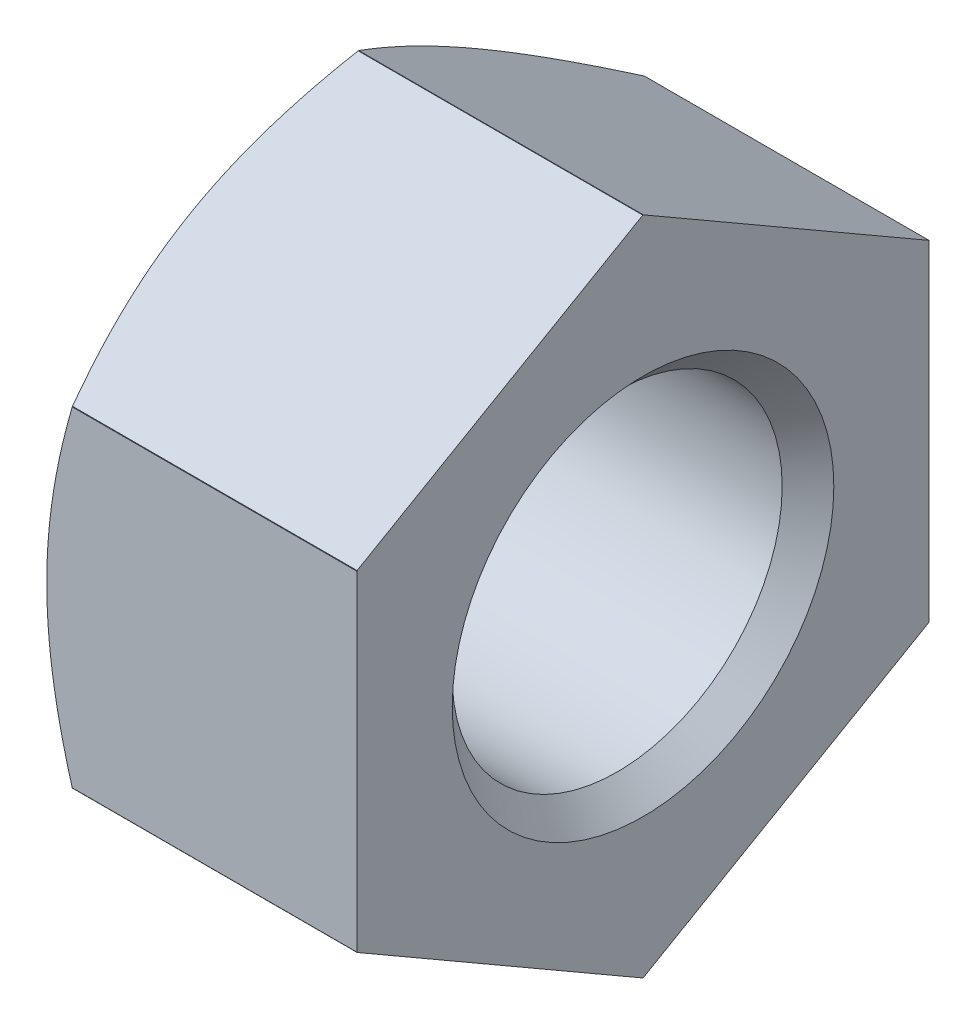
ISO-10303-21;
HEADER;
FILE_DESCRIPTION(('STEP AP214'),'2;1');
FILE_NAME('part.step','',(''),(''),'','','');
FILE_SCHEMA(('AUTOMOTIVE_DESIGN { 1 0 10303 214 1 1 1 1 }'));
ENDSEC;
DATA;
#1=APPLICATION_CONTEXT('core data for automotive mechanical design processes');
#2=APPLICATION_PROTOCOL_DEFINITION('international standard','automotive_design',2000,#1);
#3=PRODUCT_CONTEXT('',#1,'mechanical');
#4=PRODUCT('Part','Part','',(#3));
#5=PRODUCT_RELATED_PRODUCT_CATEGORY('part','',(#4));
#6=PRODUCT_DEFINITION_FORMATION('','',#4);
#7=PRODUCT_DEFINITION_CONTEXT('part definition',#1,'design');
#8=PRODUCT_DEFINITION('design','',#6,#7);
#9=PRODUCT_DEFINITION_SHAPE('','',#8);
#10=(LENGTH_UNIT() NAMED_UNIT(*) SI_UNIT(.MILLI.,.METRE.));
#11=(NAMED_UNIT(*) PLANE_ANGLE_UNIT() SI_UNIT($,.RADIAN.));
#12=(NAMED_UNIT(*) SI_UNIT($,.STERADIAN.) SOLID_ANGLE_UNIT());
#13=UNCERTAINTY_MEASURE_WITH_UNIT(LENGTH_MEASURE(1.E-05),#10,'distance_accuracy_value','');
#14=(GEOMETRIC_REPRESENTATION_CONTEXT(3) GLOBAL_UNCERTAINTY_ASSIGNED_CONTEXT((#13)) GLOBAL_UNIT_ASSIGNED_CONTEXT((#10,
#11,#12)) REPRESENTATION_CONTEXT('',''));
#15=CARTESIAN_POINT('',(0.,0.,0.));
#16=DIRECTION('',(0.,0.,1.));
#17=DIRECTION('',(1.,0.,0.));
#18=AXIS2_PLACEMENT_3D('',#15,#16,#17);
#19=CARTESIAN_POINT('',(-6.5,0.,0.));
#20=DIRECTION('',(1.,0.,0.));
#21=DIRECTION('',(0.,0.,-1.));
#22=AXIS2_PLACEMENT_3D('',#19,#20,#21);
#23=CONICAL_SURFACE('',#22,12.,1.0471975511966);
#24=CARTESIAN_POINT('',(-5.43190200199919,0.,0.));
#25=DIRECTION('',(1.,0.,0.));
#26=DIRECTION('',(0.,0.,-1.));
#27=AXIS2_PLACEMENT_3D('',#24,#25,#26);
#28=CIRCLE('',#27,13.85);
#29=CARTESIAN_POINT('',(-5.43190200199919,-6.91538140669045,12.));
#30=VERTEX_POINT('',#29);
#31=CARTESIAN_POINT('',(-5.43190200199919,-6.93461414206804,11.9888959750525));
#32=VERTEX_POINT('',#31);
#33=EDGE_CURVE('E319',#30,#32,#28,.T.);
#34=ORIENTED_EDGE('',*,*,#33,.F.);
#35=CARTESIAN_POINT('',(-0.757927526922083,-18.3741029494494,12.));
#36=CARTESIAN_POINT('',(-0.885260822662816,-18.1106808035902,12.));
#37=CARTESIAN_POINT('',(-1.01193507119495,-17.8469402441711,12.));
#38=CARTESIAN_POINT('',(-1.26381419692446,-17.3187550288704,12.));
#39=CARTESIAN_POINT('',(-1.38901905797828,-17.0543103652923,12.));
#40=CARTESIAN_POINT('',(-1.7622389296602,-16.2597418499713,12.));
#41=CARTESIAN_POINT('',(-2.00781770862917,-15.7284691213862,12.));
#42=CARTESIAN_POINT('',(-2.49229843461505,-14.6592118406064,12.));
#43=CARTESIAN_POINT('',(-2.7311541257373,-14.1212062772096,12.));
#44=CARTESIAN_POINT('',(-3.19860942107949,-13.0407736014293,12.));
#45=CARTESIAN_POINT('',(-3.42720955994547,-12.4983467212856,12.));
#46=CARTESIAN_POINT('',(-3.87413298289837,-11.4014775288701,12.));
#47=CARTESIAN_POINT('',(-4.09229571424787,-10.8469694543956,12.));
#48=CARTESIAN_POINT('',(-4.5115342101104,-9.73140877724123,12.));
#49=CARTESIAN_POINT('',(-4.71260807351314,-9.17035545428785,12.));
#50=CARTESIAN_POINT('',(-5.09226294047572,-8.04198268106347,12.));
#51=CARTESIAN_POINT('',(-5.27089176830113,-7.47467945477915,12.));
#52=CARTESIAN_POINT('',(-5.5998637219091,-6.33195340918127,12.));
#53=CARTESIAN_POINT('',(-5.75021579315801,-5.75653321983807,12.));
#54=CARTESIAN_POINT('',(-5.94903218423929,-4.8872057450023,12.));
#55=CARTESIAN_POINT('',(-6.01086255084975,-4.59633525052163,12.));
#56=CARTESIAN_POINT('',(-6.12464301765479,-4.0126582574801,12.));
#57=CARTESIAN_POINT('',(-6.1765933329094,-3.71985180120309,12.));
#58=CARTESIAN_POINT('',(-6.26969355142856,-3.13249368902774,12.));
#59=CARTESIAN_POINT('',(-6.31084257234311,-2.83794189256234,12.));
#60=CARTESIAN_POINT('',(-6.3815108239869,-2.247448713856,12.));
#61=CARTESIAN_POINT('',(-6.41103051995103,-1.95150738768304,12.));
#62=CARTESIAN_POINT('',(-6.45764834044768,-1.36052731467124,12.));
#63=CARTESIAN_POINT('',(-6.47482393929811,-1.06549471929991,12.));
#64=CARTESIAN_POINT('',(-6.4966623552002,-0.474967566223815,12.));
#65=CARTESIAN_POINT('',(-6.50132533469031,-0.179473014565973,12.));
#66=CARTESIAN_POINT('',(-6.49802788750281,0.411363860950024,12.));
#67=CARTESIAN_POINT('',(-6.49007100291559,0.706706204256779,12.));
#68=CARTESIAN_POINT('',(-6.46173155162532,1.29679806430548,12.));
#69=CARTESIAN_POINT('',(-6.44134836459105,1.59154755071448,12.));
#70=CARTESIAN_POINT('',(-6.37731043762117,2.30594606358188,12.));
#71=CARTESIAN_POINT('',(-6.32742876921308,2.72504606016678,12.));
#72=CARTESIAN_POINT('',(-6.20531157582008,3.56003413695209,12.));
#73=CARTESIAN_POINT('',(-6.13306995085723,3.97592130889583,12.));
#74=CARTESIAN_POINT('',(-5.96879494132217,4.80414082533594,12.));
#75=CARTESIAN_POINT('',(-5.87674284161843,5.21646942223613,12.));
#76=CARTESIAN_POINT('',(-5.67565579750479,6.03688413058347,12.));
#77=CARTESIAN_POINT('',(-5.56662245268445,6.44497063776614,12.));
#78=CARTESIAN_POINT('',(-5.33133023705024,7.26695179192741,12.));
#79=CARTESIAN_POINT('',(-5.20471466714229,7.68074363990891,12.));
#80=CARTESIAN_POINT('',(-4.93897810435373,8.5039527317277,12.));
#81=CARTESIAN_POINT('',(-4.79986573739325,8.91337277809569,12.));
#82=CARTESIAN_POINT('',(-4.51199132897044,9.72619919952538,12.));
#83=CARTESIAN_POINT('',(-4.36328801163378,10.1296264525863,12.));
#84=CARTESIAN_POINT('',(-4.13374059216835,10.7323754675621,12.));
#85=CARTESIAN_POINT('',(-4.05612530245974,10.9329360828662,12.));
#86=CARTESIAN_POINT('',(-3.89892093988125,11.333277207607,12.));
#87=CARTESIAN_POINT('',(-3.81933191298797,11.5330577350899,12.));
#88=CARTESIAN_POINT('',(-3.73884482138752,11.7324762572811,12.));
#89=B_SPLINE_CURVE_WITH_KNOTS('',3,(#35,#36,#37,#38,#39,#40,#41,#42,#43,#44,#45,#46,#47,#48,#49,
#50,#51,#52,#53,#54,#55,#56,#57,#58,#59,#60,#61,#62,#63,#64,#65,#66,#67,#68,#69,#70,#71,#72,#73,
#74,#75,#76,#77,#78,#79,#80,#81,#82,#83,#84,#85,#86,#87,#88),.UNSPECIFIED.,.F.,.F.,(4,2,2,2,2,2,
2,2,2,2,2,2,2,2,2,2,2,2,2,2,2,2,2,2,2,2,4),(0.,0.877748230184936,1.75550609481917,
3.51130735039889,5.27715724351261,7.04291497149047,8.83034291642293,10.6179694503848,
12.4017200100453,14.184905320284,15.0768731076703,15.9688214772858,16.8608426868666,
17.7528282072264,18.6391653423303,19.525490970976,20.41156787349,21.2976890133128,
22.5631579147536,23.8289723511392,25.0959879045465,26.362884180457,27.660832313829,
28.9578913226118,30.2476493893806,30.89280627481,31.5379481459269),.UNSPECIFIED.);
#90=CARTESIAN_POINT('',(-6.5,0.,12.));
#91=VERTEX_POINT('',#90);
#92=EDGE_CURVE('E160',#30,#91,#89,.T.);
#93=ORIENTED_EDGE('',*,*,#92,.T.);
#94=CARTESIAN_POINT('',(-6.5,0.,0.));
#95=DIRECTION('',(1.,0.,0.));
#96=DIRECTION('',(0.,0.,-1.));
#97=AXIS2_PLACEMENT_3D('',#94,#95,#96);
#98=CIRCLE('',#97,12.);
#99=CARTESIAN_POINT('',(-6.5,-10.3923048454133,6.));
#100=VERTEX_POINT('',#99);
#101=EDGE_CURVE('E153',#91,#100,#98,.T.);
#102=ORIENTED_EDGE('',*,*,#101,.T.);
#103=CARTESIAN_POINT('',(-5.43178412335734,-13.8502,0.0107499050095311));
#104=CARTESIAN_POINT('',(-5.51954638529781,-13.6979738038674,0.274413410954166));
#105=CARTESIAN_POINT('',(-5.60331559726915,-13.5451538807077,0.539105282275555));
#106=CARTESIAN_POINT('',(-5.76175983099681,-13.2382892700276,1.07061037901832));
#107=CARTESIAN_POINT('',(-5.83643186228856,-13.0842441974027,1.33742427146024));
#108=CARTESIAN_POINT('',(-5.9756755793296,-12.7746338925914,1.87368504994032));
#109=CARTESIAN_POINT('',(-6.0402234856649,-12.6190659670349,2.14313660103218));
#110=CARTESIAN_POINT('',(-6.15783260004203,-12.3068511000128,2.68390861359285));
#111=CARTESIAN_POINT('',(-6.21089446519067,-12.1502042208025,2.95522896723224));
#112=CARTESIAN_POINT('',(-6.30327643468492,-11.8398391225771,3.49279708625475));
#113=CARTESIAN_POINT('',(-6.3429029056729,-11.6861438399104,3.7590051247172));
#114=CARTESIAN_POINT('',(-6.40929551949309,-11.3780520477653,4.29263576210746));
#115=CARTESIAN_POINT('',(-6.43606141293658,-11.2236555247472,4.56005838448664));
#116=CARTESIAN_POINT('',(-6.47605719279432,-10.9146058526798,5.09534811856997));
#117=CARTESIAN_POINT('',(-6.4893031052307,-10.7599532256232,5.36321432615598));
#118=CARTESIAN_POINT('',(-6.50197442821406,-10.4505086981026,5.89918796994576));
#119=CARTESIAN_POINT('',(-6.50140027079916,-10.2957168021437,6.16729539834655));
#120=CARTESIAN_POINT('',(-6.4874393555501,-10.0067403447611,6.66781730472444));
#121=CARTESIAN_POINT('',(-6.47575492760503,-9.87253437048549,6.9002688708491));
#122=CARTESIAN_POINT('',(-6.44221872865832,-9.60443172221048,7.36463627930519));
#123=CARTESIAN_POINT('',(-6.42036624578965,-9.47053507052651,7.59655208298518));
#124=CARTESIAN_POINT('',(-6.36687229345426,-9.2031235281042,8.05972246099098));
#125=CARTESIAN_POINT('',(-6.33522282499089,-9.06960903962346,8.2909763385862));
#126=CARTESIAN_POINT('',(-6.26268633334446,-8.80320412855406,8.75240317994426));
#127=CARTESIAN_POINT('',(-6.22179868699997,-8.67031374868223,8.9825760697194));
#128=CARTESIAN_POINT('',(-6.08424821977632,-8.2669409610675,9.68123823225881));
#129=CARTESIAN_POINT('',(-5.97391418845705,-7.99762212777088,10.1477121349637));
#130=CARTESIAN_POINT('',(-5.72355518880478,-7.46298250917926,11.0737351181037));
#131=CARTESIAN_POINT('',(-5.58358838305639,-7.19765496688166,11.5332959020105));
#132=CARTESIAN_POINT('',(-5.4317020019992,-6.93426726314663,11.9894967869685));
#133=B_SPLINE_CURVE_WITH_KNOTS('',3,(#103,#104,#105,#106,#107,#108,#109,#110,#111,#112,#113,
#114,#115,#116,#117,#118,#119,#120,#121,#122,#123,#124,#125,#126,#127,#128,#129,#130,#131,#132),
.UNSPECIFIED.,.F.,.F.,(4,2,2,2,2,2,2,2,2,2,2,2,2,2,4),(0.,0.950572713737903,1.90145706550251,
2.85454243507171,3.80757326500351,4.73712269275389,5.66669014534033,6.5951544432594,
7.5235897158951,8.32939544034746,9.13525758786965,9.94177944518852,10.7483557227025,
12.3968110169832,14.0420602673549),.UNSPECIFIED.);
#134=EDGE_CURVE('E126',#100,#32,#133,.T.);
#135=ORIENTED_EDGE('',*,*,#134,.T.);
#136=EDGE_LOOP('',(#34,#93,#102,#135));
#137=FACE_BOUND('',#136,.T.);
#138=ADVANCED_FACE('F16',(#137),#23,.T.);
#139=CARTESIAN_POINT('',(-6.5,10.3923048454133,6.));
#140=VERTEX_POINT('',#139);
#141=EDGE_CURVE('E161',#140,#91,#98,.T.);
#142=ORIENTED_EDGE('',*,*,#141,.T.);
#143=CARTESIAN_POINT('',(-5.43190200199919,6.91538140669045,12.));
#144=VERTEX_POINT('',#143);
#145=EDGE_CURVE('E225',#91,#144,#89,.T.);
#146=ORIENTED_EDGE('',*,*,#145,.T.);
#147=CARTESIAN_POINT('',(-5.43190200199919,6.93461414206805,11.9888959750525));
#148=VERTEX_POINT('',#147);
#149=EDGE_CURVE('E339',#148,#144,#28,.T.);
#150=ORIENTED_EDGE('',*,*,#149,.F.);
#151=CARTESIAN_POINT('',(-5.43170200199919,6.93426726314663,11.9894967869685));
#152=CARTESIAN_POINT('',(-5.5194676389763,7.08649461080452,11.7258312865235));
#153=CARTESIAN_POINT('',(-5.60324031293054,7.23931569065741,11.4611374117508));
#154=CARTESIAN_POINT('',(-5.76169162740055,7.54618263899107,10.9296282660733));
#155=CARTESIAN_POINT('',(-5.83636727748469,7.70022889258637,10.6628123281306));
#156=CARTESIAN_POINT('',(-5.97561839288176,8.00984163269987,10.1265473315834));
#157=CARTESIAN_POINT('',(-6.04017007685509,8.16541081292757,9.85709360733716));
#158=CARTESIAN_POINT('',(-6.15778683720267,8.47762824215075,9.31631715691408));
#159=CARTESIAN_POINT('',(-6.21085257069147,8.6342764288866,9.04499453857403));
#160=CARTESIAN_POINT('',(-6.30324219234936,8.94464412161213,8.5074219257455));
#161=CARTESIAN_POINT('',(-6.34287245083263,9.09834068927069,8.24121166161192));
#162=CARTESIAN_POINT('',(-6.40927259713642,9.4064351269859,7.70757644195981));
#163=CARTESIAN_POINT('',(-6.43604223556411,9.56083301058385,7.44015146298706));
#164=CARTESIAN_POINT('',(-6.47604536531801,9.8698854733242,6.90485689531648));
#165=CARTESIAN_POINT('',(-6.48929488371125,10.0245395303485,6.63698821095383));
#166=CARTESIAN_POINT('',(-6.50197319012622,10.3339869968297,6.10100947673489));
#167=CARTESIAN_POINT('',(-6.50140241026684,10.4887804017783,5.83289943468725));
#168=CARTESIAN_POINT('',(-6.48744764612505,10.7777569185845,5.33237742538465));
#169=CARTESIAN_POINT('',(-6.47576624921605,10.9119614375112,5.09992837999829));
#170=CARTESIAN_POINT('',(-6.44223625182418,11.1800612346947,4.63556590977753));
#171=CARTESIAN_POINT('',(-6.42038693952648,11.3139564906417,4.40365252358494));
#172=CARTESIAN_POINT('',(-6.36689940946633,11.581365295729,3.94048688678237));
#173=CARTESIAN_POINT('',(-6.33525319296208,11.7148784426688,3.70923533280428));
#174=CARTESIAN_POINT('',(-6.26272323054005,11.9812807226483,3.24781304862764));
#175=CARTESIAN_POINT('',(-6.22183886147274,12.1141698129754,3.01764239240948));
#176=CARTESIAN_POINT('',(-6.08429835406982,12.5175386743094,2.3189870303878));
#177=CARTESIAN_POINT('',(-5.97397097377286,12.7868549423786,1.85251757078705));
#178=CARTESIAN_POINT('',(-5.72362494311967,13.3214895761709,0.926503221572832));
#179=CARTESIAN_POINT('',(-5.58366445276763,13.5868146983092,0.466946629504849));
#180=CARTESIAN_POINT('',(-5.43178412335734,13.8502,0.010749905009532));
#181=B_SPLINE_CURVE_WITH_KNOTS('',3,(#151,#152,#153,#154,#155,#156,#157,#158,#159,#160,#161,
#162,#163,#164,#165,#166,#167,#168,#169,#170,#171,#172,#173,#174,#175,#176,#177,#178,#179,#180),
.UNSPECIFIED.,.F.,.F.,(4,2,2,2,2,2,2,2,2,2,2,2,2,2,4),(0.,0.950582158069122,1.90147595913919,
2.85457100728535,3.80761151416831,4.73717004316529,5.66674659741063,6.59521992519702,
7.52366422247089,8.32946083280679,9.13531386220705,9.94182657819448,10.7483937128688,
12.3968299015406,14.0420602587557),.UNSPECIFIED.);
#182=EDGE_CURVE('E257',#148,#140,#181,.T.);
#183=ORIENTED_EDGE('',*,*,#182,.T.);
#184=EDGE_LOOP('',(#142,#146,#150,#183));
#185=FACE_BOUND('',#184,.T.);
#186=ADVANCED_FACE('F370',(#185),#23,.T.);
#187=CARTESIAN_POINT('',(-6.5,0.,-12.));
#188=VERTEX_POINT('',#187);
#189=CARTESIAN_POINT('',(-6.5,10.3923048454133,-6.));
#190=VERTEX_POINT('',#189);
#191=EDGE_CURVE('E167',#188,#190,#98,.T.);
#192=ORIENTED_EDGE('',*,*,#191,.T.);
#193=CARTESIAN_POINT('',(-5.43178412335734,13.8502,-0.0107499050095311));
#194=CARTESIAN_POINT('',(-5.51954638529781,13.6979738038674,-0.274413410954166));
#195=CARTESIAN_POINT('',(-5.60331559726915,13.5451538807077,-0.539105282275555));
#196=CARTESIAN_POINT('',(-5.76175983099681,13.2382892700276,-1.07061037901832));
#197=CARTESIAN_POINT('',(-5.83643186228856,13.0842441974027,-1.33742427146024));
#198=CARTESIAN_POINT('',(-5.9756755793296,12.7746338925914,-1.87368504994032));
#199=CARTESIAN_POINT('',(-6.0402234856649,12.6190659670349,-2.14313660103218));
#200=CARTESIAN_POINT('',(-6.15783260004203,12.3068511000128,-2.68390861359285));
#201=CARTESIAN_POINT('',(-6.21089446519067,12.1502042208025,-2.95522896723224));
#202=CARTESIAN_POINT('',(-6.30327643468492,11.8398391225771,-3.49279708625475));
#203=CARTESIAN_POINT('',(-6.3429029056729,11.6861438399104,-3.7590051247172));
#204=CARTESIAN_POINT('',(-6.40929551949309,11.3780520477653,-4.29263576210746));
#205=CARTESIAN_POINT('',(-6.43606141293658,11.2236555247472,-4.56005838448664));
#206=CARTESIAN_POINT('',(-6.47605719279432,10.9146058526798,-5.09534811856997));
#207=CARTESIAN_POINT('',(-6.4893031052307,10.7599532256232,-5.36321432615598));
#208=CARTESIAN_POINT('',(-6.50197442821406,10.4505086981026,-5.89918796994576));
#209=CARTESIAN_POINT('',(-6.50140027079916,10.2957168021437,-6.16729539834655));
#210=CARTESIAN_POINT('',(-6.4874393555501,10.0067403447611,-6.66781730472444));
#211=CARTESIAN_POINT('',(-6.47575492760503,9.87253437048549,-6.9002688708491));
#212=CARTESIAN_POINT('',(-6.44221872865832,9.60443172221048,-7.36463627930519));
#213=CARTESIAN_POINT('',(-6.42036624578965,9.47053507052651,-7.59655208298518));
#214=CARTESIAN_POINT('',(-6.36687229345426,9.2031235281042,-8.05972246099098));
#215=CARTESIAN_POINT('',(-6.33522282499089,9.06960903962346,-8.2909763385862));
#216=CARTESIAN_POINT('',(-6.26268633334446,8.80320412855406,-8.75240317994426));
#217=CARTESIAN_POINT('',(-6.22179868699997,8.67031374868223,-8.9825760697194));
#218=CARTESIAN_POINT('',(-6.08424821977632,8.2669409610675,-9.68123823225881));
#219=CARTESIAN_POINT('',(-5.97391418845705,7.99762212777088,-10.1477121349637));
#220=CARTESIAN_POINT('',(-5.72355518880478,7.46298250917926,-11.0737351181037));
#221=CARTESIAN_POINT('',(-5.58358838305639,7.19765496688166,-11.5332959020105));
#222=CARTESIAN_POINT('',(-5.4317020019992,6.93426726314663,-11.9894967869685));
#223=B_SPLINE_CURVE_WITH_KNOTS('',3,(#193,#194,#195,#196,#197,#198,#199,#200,#201,#202,#203,
#204,#205,#206,#207,#208,#209,#210,#211,#212,#213,#214,#215,#216,#217,#218,#219,#220,#221,#222),
.UNSPECIFIED.,.F.,.F.,(4,2,2,2,2,2,2,2,2,2,2,2,2,2,4),(0.,0.950572713737903,1.90145706550251,
2.85454243507171,3.80757326500351,4.73712269275389,5.66669014534033,6.5951544432594,
7.5235897158951,8.32939544034746,9.13525758786965,9.94177944518852,10.7483557227025,
12.3968110169832,14.0420602673549),.UNSPECIFIED.);
#224=CARTESIAN_POINT('',(-5.43190200199919,6.93461414206804,-11.9888959750525));
#225=VERTEX_POINT('',#224);
#226=EDGE_CURVE('E271',#190,#225,#223,.T.);
#227=ORIENTED_EDGE('',*,*,#226,.T.);
#228=CARTESIAN_POINT('',(-5.43190200199919,6.91538140669045,-12.));
#229=VERTEX_POINT('',#228);
#230=EDGE_CURVE('E340',#229,#225,#28,.T.);
#231=ORIENTED_EDGE('',*,*,#230,.F.);
#232=CARTESIAN_POINT('',(-0.757927526922083,-18.3741029494494,-12.));
#233=CARTESIAN_POINT('',(-0.885260822662816,-18.1106808035902,-12.));
#234=CARTESIAN_POINT('',(-1.01193507119495,-17.8469402441711,-12.));
#235=CARTESIAN_POINT('',(-1.26381419692446,-17.3187550288704,-12.));
#236=CARTESIAN_POINT('',(-1.38901905797828,-17.0543103652923,-12.));
#237=CARTESIAN_POINT('',(-1.7622389296602,-16.2597418499713,-12.));
#238=CARTESIAN_POINT('',(-2.00781770862917,-15.7284691213862,-12.));
#239=CARTESIAN_POINT('',(-2.49229843461505,-14.6592118406064,-12.));
#240=CARTESIAN_POINT('',(-2.7311541257373,-14.1212062772096,-12.));
#241=CARTESIAN_POINT('',(-3.19860942107949,-13.0407736014293,-12.));
#242=CARTESIAN_POINT('',(-3.42720955994547,-12.4983467212856,-12.));
#243=CARTESIAN_POINT('',(-3.87413298289837,-11.4014775288701,-12.));
#244=CARTESIAN_POINT('',(-4.09229571424787,-10.8469694543956,-12.));
#245=CARTESIAN_POINT('',(-4.5115342101104,-9.73140877724123,-12.));
#246=CARTESIAN_POINT('',(-4.71260807351314,-9.17035545428785,-12.));
#247=CARTESIAN_POINT('',(-5.09226294047572,-8.04198268106347,-12.));
#248=CARTESIAN_POINT('',(-5.27089176830113,-7.47467945477915,-12.));
#249=CARTESIAN_POINT('',(-5.5998637219091,-6.33195340918127,-12.));
#250=CARTESIAN_POINT('',(-5.75021579315801,-5.75653321983807,-12.));
#251=CARTESIAN_POINT('',(-5.94903218423929,-4.8872057450023,-12.));
#252=CARTESIAN_POINT('',(-6.01086255084975,-4.59633525052163,-12.));
#253=CARTESIAN_POINT('',(-6.12464301765479,-4.0126582574801,-12.));
#254=CARTESIAN_POINT('',(-6.1765933329094,-3.71985180120309,-12.));
#255=CARTESIAN_POINT('',(-6.26969355142856,-3.13249368902774,-12.));
#256=CARTESIAN_POINT('',(-6.31084257234311,-2.83794189256234,-12.));
#257=CARTESIAN_POINT('',(-6.3815108239869,-2.247448713856,-12.));
#258=CARTESIAN_POINT('',(-6.41103051995103,-1.95150738768304,-12.));
#259=CARTESIAN_POINT('',(-6.45764834044768,-1.36052731467124,-12.));
#260=CARTESIAN_POINT('',(-6.47482393929811,-1.06549471929991,-12.));
#261=CARTESIAN_POINT('',(-6.4966623552002,-0.474967566223815,-12.));
#262=CARTESIAN_POINT('',(-6.50132533469031,-0.179473014565973,-12.));
#263=CARTESIAN_POINT('',(-6.49802788750281,0.411363860950024,-12.));
#264=CARTESIAN_POINT('',(-6.49007100291559,0.706706204256779,-12.));
#265=CARTESIAN_POINT('',(-6.46173155162532,1.29679806430548,-12.));
#266=CARTESIAN_POINT('',(-6.44134836459105,1.59154755071448,-12.));
#267=CARTESIAN_POINT('',(-6.37731043762117,2.30594606358188,-12.));
#268=CARTESIAN_POINT('',(-6.32742876921308,2.72504606016678,-12.));
#269=CARTESIAN_POINT('',(-6.20531157582008,3.56003413695209,-12.));
#270=CARTESIAN_POINT('',(-6.13306995085723,3.97592130889583,-12.));
#271=CARTESIAN_POINT('',(-5.96879494132217,4.80414082533594,-12.));
#272=CARTESIAN_POINT('',(-5.87674284161843,5.21646942223613,-12.));
#273=CARTESIAN_POINT('',(-5.67565579750479,6.03688413058347,-12.));
#274=CARTESIAN_POINT('',(-5.56662245268445,6.44497063776614,-12.));
#275=CARTESIAN_POINT('',(-5.33133023705024,7.26695179192741,-12.));
#276=CARTESIAN_POINT('',(-5.20471466714229,7.68074363990891,-12.));
#277=CARTESIAN_POINT('',(-4.93897810435373,8.5039527317277,-12.));
#278=CARTESIAN_POINT('',(-4.79986573739325,8.91337277809569,-12.));
#279=CARTESIAN_POINT('',(-4.51199132897044,9.72619919952538,-12.));
#280=CARTESIAN_POINT('',(-4.36328801163378,10.1296264525863,-12.));
#281=CARTESIAN_POINT('',(-4.13374059216835,10.7323754675621,-12.));
#282=CARTESIAN_POINT('',(-4.05612530245974,10.9329360828662,-12.));
#283=CARTESIAN_POINT('',(-3.89892093988125,11.333277207607,-12.));
#284=CARTESIAN_POINT('',(-3.81933191298797,11.5330577350899,-12.));
#285=CARTESIAN_POINT('',(-3.73884482138752,11.7324762572811,-12.));
#286=B_SPLINE_CURVE_WITH_KNOTS('',3,(#232,#233,#234,#235,#236,#237,#238,#239,#240,#241,#242,
#243,#244,#245,#246,#247,#248,#249,#250,#251,#252,#253,#254,#255,#256,#257,#258,#259,#260,#261,
#262,#263,#264,#265,#266,#267,#268,#269,#270,#271,#272,#273,#274,#275,#276,#277,#278,#279,#280,
#281,#282,#283,#284,#285),.UNSPECIFIED.,.F.,.F.,(4,2,2,2,2,2,2,2,2,2,2,2,2,2,2,2,2,2,2,2,2,2,2,
2,2,2,4),(0.,0.877748230184936,1.75550609481917,3.51130735039889,5.27715724351261,
7.04291497149047,8.83034291642293,10.6179694503848,12.4017200100453,14.184905320284,
15.0768731076703,15.9688214772858,16.8608426868666,17.7528282072264,18.6391653423303,
19.525490970976,20.41156787349,21.2976890133128,22.5631579147536,23.8289723511392,
25.0959879045465,26.362884180457,27.660832313829,28.9578913226118,30.2476493893806,
30.89280627481,31.5379481459269),.UNSPECIFIED.);
#287=EDGE_CURVE('E281',#229,#188,#286,.F.);
#288=ORIENTED_EDGE('',*,*,#287,.T.);
#289=EDGE_LOOP('',(#192,#227,#231,#288));
#290=FACE_BOUND('',#289,.T.);
#291=ADVANCED_FACE('F356',(#290),#23,.T.);
#292=CARTESIAN_POINT('',(-6.5,-10.3923048454133,-6.));
#293=VERTEX_POINT('',#292);
#294=EDGE_CURVE('E157',#293,#188,#98,.T.);
#295=ORIENTED_EDGE('',*,*,#294,.T.);
#296=CARTESIAN_POINT('',(-5.43190200199919,-6.91538140669045,-12.));
#297=VERTEX_POINT('',#296);
#298=EDGE_CURVE('E280',#188,#297,#286,.F.);
#299=ORIENTED_EDGE('',*,*,#298,.T.);
#300=CARTESIAN_POINT('',(-5.43190200199919,-6.93461414206805,-11.9888959750525));
#301=VERTEX_POINT('',#300);
#302=EDGE_CURVE('E331',#301,#297,#28,.T.);
#303=ORIENTED_EDGE('',*,*,#302,.F.);
#304=CARTESIAN_POINT('',(-5.43170200199919,-6.93426726314663,-11.9894967869685));
#305=CARTESIAN_POINT('',(-5.5194676389763,-7.08649461080452,-11.7258312865235));
#306=CARTESIAN_POINT('',(-5.60324031293054,-7.23931569065741,-11.4611374117508));
#307=CARTESIAN_POINT('',(-5.76169162740055,-7.54618263899107,-10.9296282660733));
#308=CARTESIAN_POINT('',(-5.83636727748469,-7.70022889258637,-10.6628123281306));
#309=CARTESIAN_POINT('',(-5.97561839288176,-8.00984163269987,-10.1265473315834));
#310=CARTESIAN_POINT('',(-6.04017007685509,-8.16541081292757,-9.85709360733716));
#311=CARTESIAN_POINT('',(-6.15778683720267,-8.47762824215075,-9.31631715691408));
#312=CARTESIAN_POINT('',(-6.21085257069147,-8.6342764288866,-9.04499453857403));
#313=CARTESIAN_POINT('',(-6.30324219234936,-8.94464412161213,-8.5074219257455));
#314=CARTESIAN_POINT('',(-6.34287245083263,-9.09834068927069,-8.24121166161192));
#315=CARTESIAN_POINT('',(-6.40927259713642,-9.4064351269859,-7.70757644195981));
#316=CARTESIAN_POINT('',(-6.43604223556411,-9.56083301058385,-7.44015146298706));
#317=CARTESIAN_POINT('',(-6.47604536531801,-9.8698854733242,-6.90485689531648));
#318=CARTESIAN_POINT('',(-6.48929488371125,-10.0245395303485,-6.63698821095383));
#319=CARTESIAN_POINT('',(-6.50197319012622,-10.3339869968297,-6.10100947673489));
#320=CARTESIAN_POINT('',(-6.50140241026684,-10.4887804017783,-5.83289943468725));
#321=CARTESIAN_POINT('',(-6.48744764612505,-10.7777569185845,-5.33237742538465));
#322=CARTESIAN_POINT('',(-6.47576624921605,-10.9119614375112,-5.09992837999829));
#323=CARTESIAN_POINT('',(-6.44223625182418,-11.1800612346947,-4.63556590977753));
#324=CARTESIAN_POINT('',(-6.42038693952648,-11.3139564906417,-4.40365252358494));
#325=CARTESIAN_POINT('',(-6.36689940946633,-11.581365295729,-3.94048688678237));
#326=CARTESIAN_POINT('',(-6.33525319296208,-11.7148784426688,-3.70923533280428));
#327=CARTESIAN_POINT('',(-6.26272323054005,-11.9812807226483,-3.24781304862764));
#328=CARTESIAN_POINT('',(-6.22183886147274,-12.1141698129754,-3.01764239240948));
#329=CARTESIAN_POINT('',(-6.08429835406982,-12.5175386743094,-2.3189870303878));
#330=CARTESIAN_POINT('',(-5.97397097377286,-12.7868549423786,-1.85251757078705));
#331=CARTESIAN_POINT('',(-5.72362494311967,-13.3214895761709,-0.926503221572832));
#332=CARTESIAN_POINT('',(-5.58366445276763,-13.5868146983092,-0.466946629504849));
#333=CARTESIAN_POINT('',(-5.43178412335734,-13.8502,-0.010749905009532));
#334=B_SPLINE_CURVE_WITH_KNOTS('',3,(#304,#305,#306,#307,#308,#309,#310,#311,#312,#313,#314,
#315,#316,#317,#318,#319,#320,#321,#322,#323,#324,#325,#326,#327,#328,#329,#330,#331,#332,#333),
.UNSPECIFIED.,.F.,.F.,(4,2,2,2,2,2,2,2,2,2,2,2,2,2,4),(0.,0.950582158069122,1.90147595913919,
2.85457100728535,3.80761151416831,4.73717004316529,5.66674659741063,6.59521992519702,
7.52366422247089,8.32946083280679,9.13531386220705,9.94182657819448,10.7483937128688,
12.3968299015406,14.0420602587557),.UNSPECIFIED.);
#335=EDGE_CURVE('E300',#301,#293,#334,.T.);
#336=ORIENTED_EDGE('',*,*,#335,.T.);
#337=EDGE_LOOP('',(#295,#299,#303,#336));
#338=FACE_BOUND('',#337,.T.);
#339=ADVANCED_FACE('F334',(#338),#23,.T.);
#340=EDGE_CURVE('E144',#100,#293,#98,.T.);
#341=ORIENTED_EDGE('',*,*,#340,.T.);
#342=CARTESIAN_POINT('',(-5.43190200199919,-13.8499955487585,-0.0111040249475057));
#343=VERTEX_POINT('',#342);
#344=EDGE_CURVE('E185',#293,#343,#334,.T.);
#345=ORIENTED_EDGE('',*,*,#344,.T.);
#346=CARTESIAN_POINT('',(-5.43190200199919,-13.8499955487585,0.0111040249475064));
#347=VERTEX_POINT('',#346);
#348=EDGE_CURVE('E146',#347,#343,#28,.T.);
#349=ORIENTED_EDGE('',*,*,#348,.F.);
#350=EDGE_CURVE('E129',#347,#100,#133,.T.);
#351=ORIENTED_EDGE('',*,*,#350,.T.);
#352=EDGE_LOOP('',(#341,#345,#349,#351));
#353=FACE_BOUND('',#352,.T.);
#354=ADVANCED_FACE('F142',(#353),#23,.T.);
#355=CARTESIAN_POINT('',(6.5,0.,0.));
#356=DIRECTION('',(1.,0.,0.));
#357=DIRECTION('',(0.,0.,-1.));
#358=AXIS2_PLACEMENT_3D('',#355,#356,#357);
#359=CYLINDRICAL_SURFACE('',#358,13.85);
#360=ORIENTED_EDGE('',*,*,#149,.T.);
#361=DIRECTION('',(1.,0.,0.));
#362=VECTOR('',#361,1.);
#363=CARTESIAN_POINT('',(6.5,6.91538140669045,12.));
#364=LINE('',#363,#362);
#365=CARTESIAN_POINT('',(6.5,6.91538140669045,12.));
#366=VERTEX_POINT('',#365);
#367=EDGE_CURVE('E180',#144,#366,#364,.T.);
#368=ORIENTED_EDGE('',*,*,#367,.T.);
#369=CARTESIAN_POINT('',(6.5,0.,0.));
#370=DIRECTION('',(1.,0.,0.));
#371=DIRECTION('',(0.,0.,-1.));
#372=AXIS2_PLACEMENT_3D('',#369,#370,#371);
#373=CIRCLE('',#372,13.85);
#374=CARTESIAN_POINT('',(6.5,6.93461414206805,11.9888959750525));
#375=VERTEX_POINT('',#374);
#376=EDGE_CURVE('E211',#375,#366,#373,.T.);
#377=ORIENTED_EDGE('',*,*,#376,.F.);
#378=DIRECTION('',(1.,0.,0.));
#379=VECTOR('',#378,1.);
#380=CARTESIAN_POINT('',(6.5,6.93461414206805,11.9888959750525));
#381=LINE('',#380,#379);
#382=EDGE_CURVE('E265',#375,#148,#381,.F.);
#383=ORIENTED_EDGE('',*,*,#382,.T.);
#384=EDGE_LOOP('',(#360,#368,#377,#383));
#385=FACE_BOUND('',#384,.T.);
#386=ADVANCED_FACE('F379',(#385),#359,.T.);
#387=ORIENTED_EDGE('',*,*,#230,.T.);
#388=DIRECTION('',(1.,0.,0.));
#389=VECTOR('',#388,1.);
#390=CARTESIAN_POINT('',(6.5,6.93461414206804,-11.9888959750525));
#391=LINE('',#390,#389);
#392=CARTESIAN_POINT('',(6.5,6.93461414206804,-11.9888959750525));
#393=VERTEX_POINT('',#392);
#394=EDGE_CURVE('E268',#225,#393,#391,.T.);
#395=ORIENTED_EDGE('',*,*,#394,.T.);
#396=CARTESIAN_POINT('',(6.5,6.91538140669045,-12.));
#397=VERTEX_POINT('',#396);
#398=EDGE_CURVE('E206',#397,#393,#373,.T.);
#399=ORIENTED_EDGE('',*,*,#398,.F.);
#400=DIRECTION('',(1.,0.,0.));
#401=VECTOR('',#400,1.);
#402=CARTESIAN_POINT('',(6.5,6.91538140669045,-12.));
#403=LINE('',#402,#401);
#404=EDGE_CURVE('E41',#397,#229,#403,.F.);
#405=ORIENTED_EDGE('',*,*,#404,.T.);
#406=EDGE_LOOP('',(#387,#395,#399,#405));
#407=FACE_BOUND('',#406,.T.);
#408=ADVANCED_FACE('F355',(#407),#359,.T.);
#409=ORIENTED_EDGE('',*,*,#302,.T.);
#410=DIRECTION('',(1.,0.,0.));
#411=VECTOR('',#410,1.);
#412=CARTESIAN_POINT('',(6.5,-6.91538140669045,-12.));
#413=LINE('',#412,#411);
#414=CARTESIAN_POINT('',(6.5,-6.91538140669045,-12.));
#415=VERTEX_POINT('',#414);
#416=EDGE_CURVE('E189',#297,#415,#413,.T.);
#417=ORIENTED_EDGE('',*,*,#416,.T.);
#418=CARTESIAN_POINT('',(6.5,-6.93461414206804,-11.9888959750525));
#419=VERTEX_POINT('',#418);
#420=EDGE_CURVE('E204',#419,#415,#373,.T.);
#421=ORIENTED_EDGE('',*,*,#420,.F.);
#422=DIRECTION('',(1.,0.,0.));
#423=VECTOR('',#422,1.);
#424=CARTESIAN_POINT('',(6.5,-6.93461414206805,-11.9888959750525));
#425=LINE('',#424,#423);
#426=EDGE_CURVE('E307',#419,#301,#425,.F.);
#427=ORIENTED_EDGE('',*,*,#426,.T.);
#428=EDGE_LOOP('',(#409,#417,#421,#427));
#429=FACE_BOUND('',#428,.T.);
#430=ADVANCED_FACE('F329',(#429),#359,.T.);
#431=ORIENTED_EDGE('',*,*,#348,.T.);
#432=DIRECTION('',(1.,0.,0.));
#433=VECTOR('',#432,1.);
#434=CARTESIAN_POINT('',(6.5,-13.8499955487585,-0.0111040249475072));
#435=LINE('',#434,#433);
#436=CARTESIAN_POINT('',(6.5,-13.85,-0.0110963151710479));
#437=VERTEX_POINT('',#436);
#438=EDGE_CURVE('E182',#343,#437,#435,.T.);
#439=ORIENTED_EDGE('',*,*,#438,.T.);
#440=CARTESIAN_POINT('',(6.5,-13.8499955487585,0.0111040249475029));
#441=VERTEX_POINT('',#440);
#442=EDGE_CURVE('E200',#441,#437,#373,.T.);
#443=ORIENTED_EDGE('',*,*,#442,.F.);
#444=DIRECTION('',(1.,0.,0.));
#445=VECTOR('',#444,1.);
#446=CARTESIAN_POINT('',(6.5,-13.8499955487585,0.0111040249475064));
#447=LINE('',#446,#445);
#448=EDGE_CURVE('E147',#441,#347,#447,.F.);
#449=ORIENTED_EDGE('',*,*,#448,.T.);
#450=EDGE_LOOP('',(#431,#439,#443,#449));
#451=FACE_BOUND('',#450,.T.);
#452=ADVANCED_FACE('F360',(#451),#359,.T.);
#453=CARTESIAN_POINT('',(6.5,-6.91538140669045,12.));
#454=VERTEX_POINT('',#453);
#455=CARTESIAN_POINT('',(6.5,-6.93461414206804,11.9888959750525));
#456=VERTEX_POINT('',#455);
#457=EDGE_CURVE('E203',#454,#456,#373,.T.);
#458=ORIENTED_EDGE('',*,*,#457,.F.);
#459=DIRECTION('',(1.,0.,0.));
#460=VECTOR('',#459,1.);
#461=CARTESIAN_POINT('',(6.5,-6.91538140669045,12.));
#462=LINE('',#461,#460);
#463=EDGE_CURVE('E233',#454,#30,#462,.F.);
#464=ORIENTED_EDGE('',*,*,#463,.T.);
#465=ORIENTED_EDGE('',*,*,#33,.T.);
#466=DIRECTION('',(1.,0.,0.));
#467=VECTOR('',#466,1.);
#468=CARTESIAN_POINT('',(6.5,-6.93461414206804,11.9888959750525));
#469=LINE('',#468,#467);
#470=EDGE_CURVE('E132',#32,#456,#469,.T.);
#471=ORIENTED_EDGE('',*,*,#470,.T.);
#472=EDGE_LOOP('',(#458,#464,#465,#471));
#473=FACE_BOUND('',#472,.T.);
#474=ADVANCED_FACE('F317',(#473),#359,.T.);
#475=CARTESIAN_POINT('',(-6.5,0.,0.));
#476=DIRECTION('',(1.,0.,0.));
#477=DIRECTION('',(0.,0.,-1.));
#478=AXIS2_PLACEMENT_3D('',#475,#476,#477);
#479=PLANE('',#478);
#480=EDGE_CURVE('E162',#190,#140,#98,.T.);
#481=ORIENTED_EDGE('',*,*,#480,.F.);
#482=ORIENTED_EDGE('',*,*,#191,.F.);
#483=ORIENTED_EDGE('',*,*,#294,.F.);
#484=ORIENTED_EDGE('',*,*,#340,.F.);
#485=ORIENTED_EDGE('',*,*,#101,.F.);
#486=ORIENTED_EDGE('',*,*,#141,.F.);
#487=EDGE_LOOP('',(#481,#482,#483,#484,#485,#486));
#488=FACE_BOUND('',#487,.T.);
#489=CARTESIAN_POINT('',(-6.5,0.,0.));
#490=DIRECTION('',(1.,0.,0.));
#491=DIRECTION('',(0.,0.,-1.));
#492=AXIS2_PLACEMENT_3D('',#489,#490,#491);
#493=CIRCLE('',#492,8.);
#494=CARTESIAN_POINT('',(-6.5,0.,-8.));
#495=VERTEX_POINT('',#494);
#496=EDGE_CURVE('E210',#495,#495,#493,.T.);
#497=ORIENTED_EDGE('',*,*,#496,.T.);
#498=EDGE_LOOP('',(#497));
#499=FACE_BOUND('',#498,.T.);
#500=ADVANCED_FACE('F18',(#488,#499),#479,.F.);
#501=ORIENTED_EDGE('',*,*,#480,.T.);
#502=CARTESIAN_POINT('',(-5.43190200199919,13.8499955487585,0.0111040249475057));
#503=VERTEX_POINT('',#502);
#504=EDGE_CURVE('E264',#140,#503,#181,.T.);
#505=ORIENTED_EDGE('',*,*,#504,.T.);
#506=CARTESIAN_POINT('',(-5.43190200199919,13.8499955487585,-0.0111040249475064));
#507=VERTEX_POINT('',#506);
#508=EDGE_CURVE('E168',#507,#503,#28,.T.);
#509=ORIENTED_EDGE('',*,*,#508,.F.);
#510=EDGE_CURVE('E188',#507,#190,#223,.T.);
#511=ORIENTED_EDGE('',*,*,#510,.T.);
#512=EDGE_LOOP('',(#501,#505,#509,#511));
#513=FACE_BOUND('',#512,.T.);
#514=ADVANCED_FACE('F241',(#513),#23,.T.);
#515=CARTESIAN_POINT('',(6.5,13.8499955487585,-0.0111040249475029));
#516=VERTEX_POINT('',#515);
#517=CARTESIAN_POINT('',(6.5,13.85,0.0110963151710503));
#518=VERTEX_POINT('',#517);
#519=EDGE_CURVE('E20',#516,#518,#373,.T.);
#520=ORIENTED_EDGE('',*,*,#519,.F.);
#521=DIRECTION('',(1.,0.,0.));
#522=VECTOR('',#521,1.);
#523=CARTESIAN_POINT('',(6.5,13.8499955487585,-0.0111040249475064));
#524=LINE('',#523,#522);
#525=EDGE_CURVE('E186',#516,#507,#524,.F.);
#526=ORIENTED_EDGE('',*,*,#525,.T.);
#527=ORIENTED_EDGE('',*,*,#508,.T.);
#528=DIRECTION('',(1.,0.,0.));
#529=VECTOR('',#528,1.);
#530=CARTESIAN_POINT('',(6.5,13.8499955487585,0.0111040249475072));
#531=LINE('',#530,#529);
#532=EDGE_CURVE('E190',#503,#518,#531,.T.);
#533=ORIENTED_EDGE('',*,*,#532,.T.);
#534=EDGE_LOOP('',(#520,#526,#527,#533));
#535=FACE_BOUND('',#534,.T.);
#536=ADVANCED_FACE('F367',(#535),#359,.T.);
#537=CARTESIAN_POINT('',(6.5,13.85,0.));
#538=DIRECTION('',(-1.,0.,0.));
#539=DIRECTION('',(0.,0.,1.));
#540=AXIS2_PLACEMENT_3D('',#537,#538,#539);
#541=PLANE('',#540);
#542=CARTESIAN_POINT('',(6.5,0.,0.));
#543=DIRECTION('',(1.,0.,0.));
#544=DIRECTION('',(0.,0.,-1.));
#545=AXIS2_PLACEMENT_3D('',#542,#543,#544);
#546=CIRCLE('',#545,8.);
#547=CARTESIAN_POINT('',(6.5,0.,-8.));
#548=VERTEX_POINT('',#547);
#549=EDGE_CURVE('E220',#548,#548,#546,.T.);
#550=ORIENTED_EDGE('',*,*,#549,.F.);
#551=EDGE_LOOP('',(#550));
#552=FACE_BOUND('',#551,.T.);
#553=ORIENTED_EDGE('',*,*,#376,.T.);
#554=DIRECTION('',(0.,-1.,0.));
#555=VECTOR('',#554,1.);
#556=CARTESIAN_POINT('',(6.5,13.85,12.));
#557=LINE('',#556,#555);
#558=EDGE_CURVE('E11',#366,#454,#557,.T.);
#559=ORIENTED_EDGE('',*,*,#558,.T.);
#560=ORIENTED_EDGE('',*,*,#457,.T.);
#561=DIRECTION('',(0.,-0.5,-0.866025403784439));
#562=VECTOR('',#561,1.);
#563=CARTESIAN_POINT('',(6.5,-6.92980484541327,11.9972259212072));
#564=LINE('',#563,#562);
#565=EDGE_CURVE('E166',#456,#441,#564,.T.);
#566=ORIENTED_EDGE('',*,*,#565,.T.);
#567=ORIENTED_EDGE('',*,*,#442,.T.);
#568=DIRECTION('',(0.,0.5,-0.866025403784439));
#569=VECTOR('',#568,1.);
#570=CARTESIAN_POINT('',(6.5,-6.92980484541327,-11.9972259212072));
#571=LINE('',#570,#569);
#572=EDGE_CURVE('E171',#437,#419,#571,.T.);
#573=ORIENTED_EDGE('',*,*,#572,.T.);
#574=ORIENTED_EDGE('',*,*,#420,.T.);
#575=DIRECTION('',(0.,1.,0.));
#576=VECTOR('',#575,1.);
#577=CARTESIAN_POINT('',(6.5,13.85,-12.));
#578=LINE('',#577,#576);
#579=EDGE_CURVE('E169',#415,#397,#578,.T.);
#580=ORIENTED_EDGE('',*,*,#579,.T.);
#581=ORIENTED_EDGE('',*,*,#398,.T.);
#582=DIRECTION('',(0.,0.5,0.866025403784439));
#583=VECTOR('',#582,1.);
#584=CARTESIAN_POINT('',(6.5,13.8548048454133,-0.0027740787927619));
#585=LINE('',#584,#583);
#586=EDGE_CURVE('E170',#393,#516,#585,.T.);
#587=ORIENTED_EDGE('',*,*,#586,.T.);
#588=ORIENTED_EDGE('',*,*,#519,.T.);
#589=DIRECTION('',(0.,-0.5,0.866025403784439));
#590=VECTOR('',#589,1.);
#591=CARTESIAN_POINT('',(6.5,13.8548048454133,0.00277407879276219));
#592=LINE('',#591,#590);
#593=EDGE_CURVE('E26',#518,#375,#592,.T.);
#594=ORIENTED_EDGE('',*,*,#593,.T.);
#595=EDGE_LOOP('',(#553,#559,#560,#566,#567,#573,#574,#580,#581,#587,#588,#594));
#596=FACE_BOUND('',#595,.T.);
#597=ADVANCED_FACE('F321',(#552,#596),#541,.F.);
#598=CARTESIAN_POINT('',(-6.5,0.,0.));
#599=DIRECTION('',(-1.,0.,0.));
#600=DIRECTION('',(0.,0.,1.));
#601=AXIS2_PLACEMENT_3D('',#598,#599,#600);
#602=CONICAL_SURFACE('',#601,8.,0.785398163397448);
#603=CARTESIAN_POINT('',(-5.4175,0.,0.));
#604=DIRECTION('',(1.,0.,0.));
#605=DIRECTION('',(0.,0.,-1.));
#606=AXIS2_PLACEMENT_3D('',#603,#604,#605);
#607=CIRCLE('',#606,6.9175);
#608=CARTESIAN_POINT('',(-5.4175,0.,-6.9175));
#609=VERTEX_POINT('',#608);
#610=EDGE_CURVE('E215',#609,#609,#607,.T.);
#611=ORIENTED_EDGE('',*,*,#610,.T.);
#612=EDGE_LOOP('',(#611));
#613=FACE_BOUND('',#612,.T.);
#614=ORIENTED_EDGE('',*,*,#496,.F.);
#615=EDGE_LOOP('',(#614));
#616=FACE_BOUND('',#615,.T.);
#617=ADVANCED_FACE('F463',(#613,#616),#602,.F.);
#618=CARTESIAN_POINT('',(6.5,0.,0.));
#619=DIRECTION('',(1.,0.,0.));
#620=DIRECTION('',(0.,0.,-1.));
#621=AXIS2_PLACEMENT_3D('',#618,#619,#620);
#622=CYLINDRICAL_SURFACE('',#621,6.9175);
#623=CARTESIAN_POINT('',(5.4175,0.,0.));
#624=DIRECTION('',(1.,0.,0.));
#625=DIRECTION('',(0.,0.,-1.));
#626=AXIS2_PLACEMENT_3D('',#623,#624,#625);
#627=CIRCLE('',#626,6.9175);
#628=CARTESIAN_POINT('',(5.4175,0.,-6.9175));
#629=VERTEX_POINT('',#628);
#630=EDGE_CURVE('E218',#629,#629,#627,.T.);
#631=ORIENTED_EDGE('',*,*,#630,.T.);
#632=EDGE_LOOP('',(#631));
#633=FACE_BOUND('',#632,.T.);
#634=ORIENTED_EDGE('',*,*,#610,.F.);
#635=EDGE_LOOP('',(#634));
#636=FACE_BOUND('',#635,.T.);
#637=ADVANCED_FACE('F471',(#633,#636),#622,.F.);
#638=CARTESIAN_POINT('',(5.4175,0.,0.));
#639=DIRECTION('',(1.,0.,0.));
#640=DIRECTION('',(0.,0.,-1.));
#641=AXIS2_PLACEMENT_3D('',#638,#639,#640);
#642=CONICAL_SURFACE('',#641,6.9175,0.785398163397447);
#643=ORIENTED_EDGE('',*,*,#549,.T.);
#644=EDGE_LOOP('',(#643));
#645=FACE_BOUND('',#644,.T.);
#646=ORIENTED_EDGE('',*,*,#630,.F.);
#647=EDGE_LOOP('',(#646));
#648=FACE_BOUND('',#647,.T.);
#649=ADVANCED_FACE('F480',(#645,#648),#642,.F.);
#650=CARTESIAN_POINT('',(6.5,-6.92820323027551,12.));
#651=DIRECTION('',(0.,0.866025403784439,-0.5));
#652=DIRECTION('',(0.,0.5,0.866025403784439));
#653=AXIS2_PLACEMENT_3D('',#650,#651,#652);
#654=PLANE('',#653);
#655=ORIENTED_EDGE('',*,*,#134,.F.);
#656=ORIENTED_EDGE('',*,*,#350,.F.);
#657=ORIENTED_EDGE('',*,*,#448,.F.);
#658=ORIENTED_EDGE('',*,*,#565,.F.);
#659=ORIENTED_EDGE('',*,*,#470,.F.);
#660=EDGE_LOOP('',(#655,#656,#657,#658,#659));
#661=FACE_BOUND('',#660,.T.);
#662=ADVANCED_FACE('F128',(#661),#654,.F.);
#663=CARTESIAN_POINT('',(6.5,-13.856406460551,0.));
#664=DIRECTION('',(0.,0.866025403784439,0.5));
#665=DIRECTION('',(0.,-0.5,0.866025403784439));
#666=AXIS2_PLACEMENT_3D('',#663,#664,#665);
#667=PLANE('',#666);
#668=ORIENTED_EDGE('',*,*,#344,.F.);
#669=ORIENTED_EDGE('',*,*,#335,.F.);
#670=ORIENTED_EDGE('',*,*,#426,.F.);
#671=ORIENTED_EDGE('',*,*,#572,.F.);
#672=ORIENTED_EDGE('',*,*,#438,.F.);
#673=EDGE_LOOP('',(#668,#669,#670,#671,#672));
#674=FACE_BOUND('',#673,.T.);
#675=ADVANCED_FACE('F293',(#674),#667,.F.);
#676=CARTESIAN_POINT('',(6.5,-6.92820323027551,-12.));
#677=DIRECTION('',(0.,0.,1.));
#678=DIRECTION('',(1.,0.,0.));
#679=AXIS2_PLACEMENT_3D('',#676,#677,#678);
#680=PLANE('',#679);
#681=ORIENTED_EDGE('',*,*,#298,.F.);
#682=ORIENTED_EDGE('',*,*,#287,.F.);
#683=ORIENTED_EDGE('',*,*,#404,.F.);
#684=ORIENTED_EDGE('',*,*,#579,.F.);
#685=ORIENTED_EDGE('',*,*,#416,.F.);
#686=EDGE_LOOP('',(#681,#682,#683,#684,#685));
#687=FACE_BOUND('',#686,.T.);
#688=ADVANCED_FACE('F289',(#687),#680,.F.);
#689=CARTESIAN_POINT('',(6.5,6.92820323027551,-12.));
#690=DIRECTION('',(0.,-0.866025403784439,0.5));
#691=DIRECTION('',(0.,-0.5,-0.866025403784439));
#692=AXIS2_PLACEMENT_3D('',#689,#690,#691);
#693=PLANE('',#692);
#694=ORIENTED_EDGE('',*,*,#226,.F.);
#695=ORIENTED_EDGE('',*,*,#510,.F.);
#696=ORIENTED_EDGE('',*,*,#525,.F.);
#697=ORIENTED_EDGE('',*,*,#586,.F.);
#698=ORIENTED_EDGE('',*,*,#394,.F.);
#699=EDGE_LOOP('',(#694,#695,#696,#697,#698));
#700=FACE_BOUND('',#699,.T.);
#701=ADVANCED_FACE('F253',(#700),#693,.F.);
#702=CARTESIAN_POINT('',(6.5,13.856406460551,0.));
#703=DIRECTION('',(0.,-0.866025403784439,-0.5));
#704=DIRECTION('',(0.,0.5,-0.866025403784439));
#705=AXIS2_PLACEMENT_3D('',#702,#703,#704);
#706=PLANE('',#705);
#707=ORIENTED_EDGE('',*,*,#504,.F.);
#708=ORIENTED_EDGE('',*,*,#182,.F.);
#709=ORIENTED_EDGE('',*,*,#382,.F.);
#710=ORIENTED_EDGE('',*,*,#593,.F.);
#711=ORIENTED_EDGE('',*,*,#532,.F.);
#712=EDGE_LOOP('',(#707,#708,#709,#710,#711));
#713=FACE_BOUND('',#712,.T.);
#714=ADVANCED_FACE('F248',(#713),#706,.F.);
#715=CARTESIAN_POINT('',(6.5,6.92820323027551,12.));
#716=DIRECTION('',(0.,0.,-1.));
#717=DIRECTION('',(-1.,0.,0.));
#718=AXIS2_PLACEMENT_3D('',#715,#716,#717);
#719=PLANE('',#718);
#720=ORIENTED_EDGE('',*,*,#145,.F.);
#721=ORIENTED_EDGE('',*,*,#92,.F.);
#722=ORIENTED_EDGE('',*,*,#463,.F.);
#723=ORIENTED_EDGE('',*,*,#558,.F.);
#724=ORIENTED_EDGE('',*,*,#367,.F.);
#725=EDGE_LOOP('',(#720,#721,#722,#723,#724));
#726=FACE_BOUND('',#725,.T.);
#727=ADVANCED_FACE('F244',(#726),#719,.F.);
#728=CLOSED_SHELL('',(#138,#186,#291,#339,#354,#386,#408,#430,#452,#474,#500,#514,#536,#597,
#617,#637,#649,#662,#675,#688,#701,#714,#727));
#729=MANIFOLD_SOLID_BREP('B1',#728);
#730=ADVANCED_BREP_SHAPE_REPRESENTATION('',(#18,#729),#14);
#731=SHAPE_DEFINITION_REPRESENTATION(#9,#730);
ENDSEC;
END-ISO-10303-21;
